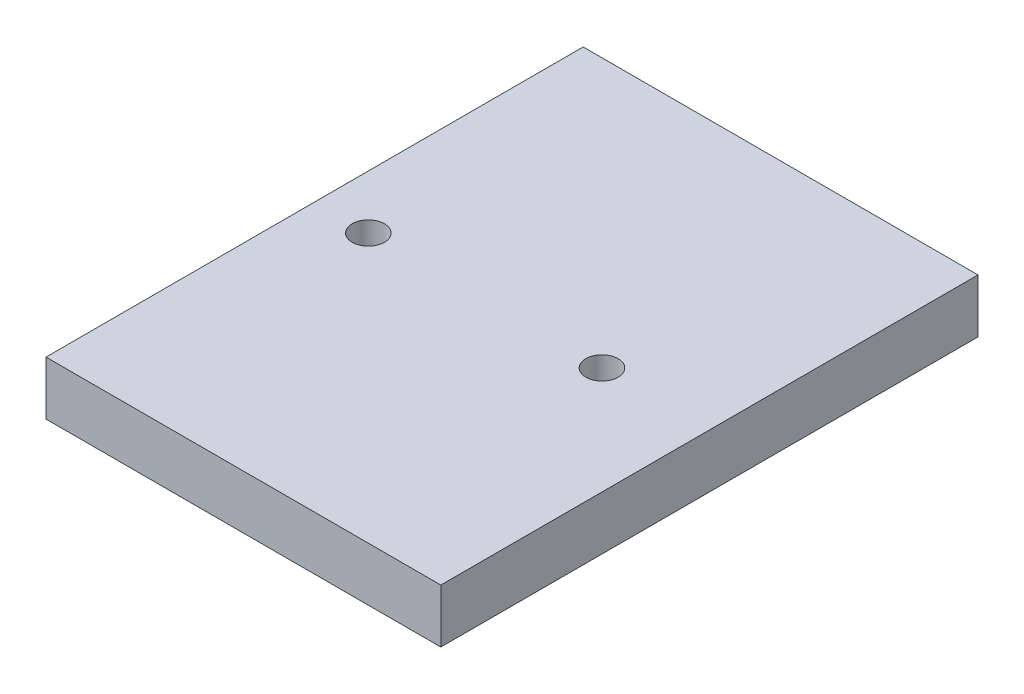
ISO-10303-21;
HEADER;
FILE_DESCRIPTION(('STEP AP214'),'2;1');
FILE_NAME('part.step','',(''),(''),'','','');
FILE_SCHEMA(('AUTOMOTIVE_DESIGN { 1 0 10303 214 1 1 1 1 }'));
ENDSEC;
DATA;
#1=APPLICATION_CONTEXT('core data for automotive mechanical design processes');
#2=APPLICATION_PROTOCOL_DEFINITION('international standard','automotive_design',2000,#1);
#3=PRODUCT_CONTEXT('',#1,'mechanical');
#4=PRODUCT('Part','Part','',(#3));
#5=PRODUCT_RELATED_PRODUCT_CATEGORY('part','',(#4));
#6=PRODUCT_DEFINITION_FORMATION('','',#4);
#7=PRODUCT_DEFINITION_CONTEXT('part definition',#1,'design');
#8=PRODUCT_DEFINITION('design','',#6,#7);
#9=PRODUCT_DEFINITION_SHAPE('','',#8);
#10=(LENGTH_UNIT() NAMED_UNIT(*) SI_UNIT(.MILLI.,.METRE.));
#11=(NAMED_UNIT(*) PLANE_ANGLE_UNIT() SI_UNIT($,.RADIAN.));
#12=(NAMED_UNIT(*) SI_UNIT($,.STERADIAN.) SOLID_ANGLE_UNIT());
#13=UNCERTAINTY_MEASURE_WITH_UNIT(LENGTH_MEASURE(1.E-05),#10,'distance_accuracy_value','');
#14=(GEOMETRIC_REPRESENTATION_CONTEXT(3) GLOBAL_UNCERTAINTY_ASSIGNED_CONTEXT((#13)) GLOBAL_UNIT_ASSIGNED_CONTEXT((#10,
#11,#12)) REPRESENTATION_CONTEXT('',''));
#15=CARTESIAN_POINT('',(0.,0.,0.));
#16=DIRECTION('',(0.,0.,1.));
#17=DIRECTION('',(1.,0.,0.));
#18=AXIS2_PLACEMENT_3D('',#15,#16,#17);
#19=CARTESIAN_POINT('',(0.,5.,0.));
#20=DIRECTION('',(0.,1.,0.));
#21=DIRECTION('',(0.,0.,1.));
#22=AXIS2_PLACEMENT_3D('',#19,#20,#21);
#23=PLANE('',#22);
#24=CARTESIAN_POINT('',(-31.75,5.,5.));
#25=DIRECTION('',(0.,1.,0.));
#26=DIRECTION('',(0.,0.,1.));
#27=AXIS2_PLACEMENT_3D('',#24,#25,#26);
#28=CIRCLE('',#27,1.5);
#29=CARTESIAN_POINT('',(-31.75,5.,6.5));
#30=VERTEX_POINT('',#29);
#31=EDGE_CURVE('E146',#30,#30,#28,.T.);
#32=ORIENTED_EDGE('',*,*,#31,.F.);
#33=EDGE_LOOP('',(#32));
#34=FACE_BOUND('',#33,.T.);
#35=DIRECTION('',(0.,0.,1.));
#36=VECTOR('',#35,1.);
#37=CARTESIAN_POINT('',(0.,5.,0.));
#38=LINE('',#37,#36);
#39=CARTESIAN_POINT('',(0.,5.,-20.));
#40=VERTEX_POINT('',#39);
#41=CARTESIAN_POINT('',(0.,5.,30.));
#42=VERTEX_POINT('',#41);
#43=EDGE_CURVE('E12',#40,#42,#38,.T.);
#44=ORIENTED_EDGE('',*,*,#43,.F.);
#45=DIRECTION('',(-1.,0.,0.));
#46=VECTOR('',#45,1.);
#47=CARTESIAN_POINT('',(0.,5.,-20.));
#48=LINE('',#47,#46);
#49=CARTESIAN_POINT('',(-36.75,5.,-20.));
#50=VERTEX_POINT('',#49);
#51=EDGE_CURVE('E118',#40,#50,#48,.T.);
#52=ORIENTED_EDGE('',*,*,#51,.T.);
#53=DIRECTION('',(0.,0.,1.));
#54=VECTOR('',#53,1.);
#55=CARTESIAN_POINT('',(-36.75,5.,0.));
#56=LINE('',#55,#54);
#57=CARTESIAN_POINT('',(-36.75,5.,30.));
#58=VERTEX_POINT('',#57);
#59=EDGE_CURVE('E74',#50,#58,#56,.T.);
#60=ORIENTED_EDGE('',*,*,#59,.T.);
#61=DIRECTION('',(-1.,0.,0.));
#62=VECTOR('',#61,1.);
#63=CARTESIAN_POINT('',(-36.75,5.,30.));
#64=LINE('',#63,#62);
#65=EDGE_CURVE('E141',#42,#58,#64,.T.);
#66=ORIENTED_EDGE('',*,*,#65,.F.);
#67=EDGE_LOOP('',(#44,#52,#60,#66));
#68=FACE_BOUND('',#67,.T.);
#69=CARTESIAN_POINT('',(-9.99999999999998,5.,5.));
#70=DIRECTION('',(0.,1.,0.));
#71=DIRECTION('',(0.,0.,1.));
#72=AXIS2_PLACEMENT_3D('',#69,#70,#71);
#73=CIRCLE('',#72,1.5);
#74=CARTESIAN_POINT('',(-9.99999999999998,5.,6.5));
#75=VERTEX_POINT('',#74);
#76=EDGE_CURVE('E143',#75,#75,#73,.T.);
#77=ORIENTED_EDGE('',*,*,#76,.F.);
#78=EDGE_LOOP('',(#77));
#79=FACE_BOUND('',#78,.T.);
#80=ADVANCED_FACE('F65',(#34,#68,#79),#23,.T.);
#81=CARTESIAN_POINT('',(0.,0.,0.));
#82=DIRECTION('',(0.,1.,0.));
#83=DIRECTION('',(0.,0.,1.));
#84=AXIS2_PLACEMENT_3D('',#81,#82,#83);
#85=PLANE('',#84);
#86=CARTESIAN_POINT('',(-31.75,0.,5.));
#87=DIRECTION('',(0.,1.,0.));
#88=DIRECTION('',(0.,0.,1.));
#89=AXIS2_PLACEMENT_3D('',#86,#87,#88);
#90=CIRCLE('',#89,2.25);
#91=CARTESIAN_POINT('',(-31.75,0.,7.25));
#92=VERTEX_POINT('',#91);
#93=EDGE_CURVE('E158',#92,#92,#90,.T.);
#94=ORIENTED_EDGE('',*,*,#93,.T.);
#95=EDGE_LOOP('',(#94));
#96=FACE_BOUND('',#95,.T.);
#97=CARTESIAN_POINT('',(-9.99999999999998,0.,5.));
#98=DIRECTION('',(0.,1.,0.));
#99=DIRECTION('',(0.,0.,1.));
#100=AXIS2_PLACEMENT_3D('',#97,#98,#99);
#101=CIRCLE('',#100,2.25);
#102=CARTESIAN_POINT('',(-9.99999999999998,0.,7.25));
#103=VERTEX_POINT('',#102);
#104=EDGE_CURVE('E163',#103,#103,#101,.T.);
#105=ORIENTED_EDGE('',*,*,#104,.T.);
#106=EDGE_LOOP('',(#105));
#107=FACE_BOUND('',#106,.T.);
#108=DIRECTION('',(0.,0.,1.));
#109=VECTOR('',#108,1.);
#110=CARTESIAN_POINT('',(-36.75,0.,0.));
#111=LINE('',#110,#109);
#112=CARTESIAN_POINT('',(-36.75,0.,-20.));
#113=VERTEX_POINT('',#112);
#114=CARTESIAN_POINT('',(-36.75,0.,30.));
#115=VERTEX_POINT('',#114);
#116=EDGE_CURVE('E148',#113,#115,#111,.T.);
#117=ORIENTED_EDGE('',*,*,#116,.F.);
#118=DIRECTION('',(1.,0.,0.));
#119=VECTOR('',#118,1.);
#120=CARTESIAN_POINT('',(0.,0.,-20.));
#121=LINE('',#120,#119);
#122=CARTESIAN_POINT('',(0.,0.,-20.));
#123=VERTEX_POINT('',#122);
#124=EDGE_CURVE('E120',#113,#123,#121,.T.);
#125=ORIENTED_EDGE('',*,*,#124,.T.);
#126=DIRECTION('',(0.,0.,1.));
#127=VECTOR('',#126,1.);
#128=CARTESIAN_POINT('',(0.,0.,0.));
#129=LINE('',#128,#127);
#130=CARTESIAN_POINT('',(0.,0.,30.));
#131=VERTEX_POINT('',#130);
#132=EDGE_CURVE('E111',#123,#131,#129,.T.);
#133=ORIENTED_EDGE('',*,*,#132,.T.);
#134=DIRECTION('',(1.,0.,0.));
#135=VECTOR('',#134,1.);
#136=CARTESIAN_POINT('',(-36.75,0.,30.));
#137=LINE('',#136,#135);
#138=EDGE_CURVE('E136',#115,#131,#137,.T.);
#139=ORIENTED_EDGE('',*,*,#138,.F.);
#140=EDGE_LOOP('',(#117,#125,#133,#139));
#141=FACE_BOUND('',#140,.T.);
#142=ADVANCED_FACE('F183',(#96,#107,#141),#85,.F.);
#143=CARTESIAN_POINT('',(-36.75,5.,0.));
#144=DIRECTION('',(1.,0.,0.));
#145=DIRECTION('',(0.,0.,-1.));
#146=AXIS2_PLACEMENT_3D('',#143,#144,#145);
#147=PLANE('',#146);
#148=CARTESIAN_POINT('',(-36.75,2.5,-10.));
#149=DIRECTION('',(-1.,0.,0.));
#150=DIRECTION('',(0.,0.,1.));
#151=AXIS2_PLACEMENT_3D('',#148,#149,#150);
#152=CIRCLE('',#151,1.);
#153=CARTESIAN_POINT('',(-36.75,2.5,-9.));
#154=VERTEX_POINT('',#153);
#155=EDGE_CURVE('E126',#154,#154,#152,.T.);
#156=ORIENTED_EDGE('',*,*,#155,.F.);
#157=EDGE_LOOP('',(#156));
#158=FACE_BOUND('',#157,.T.);
#159=CARTESIAN_POINT('',(-36.75,2.5,20.));
#160=DIRECTION('',(-1.,0.,0.));
#161=DIRECTION('',(0.,0.,1.));
#162=AXIS2_PLACEMENT_3D('',#159,#160,#161);
#163=CIRCLE('',#162,1.);
#164=CARTESIAN_POINT('',(-36.75,2.5,21.));
#165=VERTEX_POINT('',#164);
#166=EDGE_CURVE('E129',#165,#165,#163,.T.);
#167=ORIENTED_EDGE('',*,*,#166,.F.);
#168=EDGE_LOOP('',(#167));
#169=FACE_BOUND('',#168,.T.);
#170=ORIENTED_EDGE('',*,*,#116,.T.);
#171=DIRECTION('',(0.,-1.,0.));
#172=VECTOR('',#171,1.);
#173=CARTESIAN_POINT('',(-36.75,5.,30.));
#174=LINE('',#173,#172);
#175=EDGE_CURVE('E110',#58,#115,#174,.T.);
#176=ORIENTED_EDGE('',*,*,#175,.F.);
#177=ORIENTED_EDGE('',*,*,#59,.F.);
#178=DIRECTION('',(0.,-1.,0.));
#179=VECTOR('',#178,1.);
#180=CARTESIAN_POINT('',(-36.75,5.,-20.));
#181=LINE('',#180,#179);
#182=EDGE_CURVE('E108',#50,#113,#181,.T.);
#183=ORIENTED_EDGE('',*,*,#182,.T.);
#184=EDGE_LOOP('',(#170,#176,#177,#183));
#185=FACE_BOUND('',#184,.T.);
#186=ADVANCED_FACE('F67',(#158,#169,#185),#147,.F.);
#187=CARTESIAN_POINT('',(0.,5.,0.));
#188=DIRECTION('',(1.,0.,0.));
#189=DIRECTION('',(0.,0.,-1.));
#190=AXIS2_PLACEMENT_3D('',#187,#188,#189);
#191=PLANE('',#190);
#192=ORIENTED_EDGE('',*,*,#132,.F.);
#193=DIRECTION('',(0.,1.,0.));
#194=VECTOR('',#193,1.);
#195=CARTESIAN_POINT('',(0.,5.,-20.));
#196=LINE('',#195,#194);
#197=EDGE_CURVE('E133',#123,#40,#196,.T.);
#198=ORIENTED_EDGE('',*,*,#197,.T.);
#199=ORIENTED_EDGE('',*,*,#43,.T.);
#200=DIRECTION('',(0.,1.,0.));
#201=VECTOR('',#200,1.);
#202=CARTESIAN_POINT('',(0.,5.,30.));
#203=LINE('',#202,#201);
#204=EDGE_CURVE('E139',#131,#42,#203,.T.);
#205=ORIENTED_EDGE('',*,*,#204,.F.);
#206=EDGE_LOOP('',(#192,#198,#199,#205));
#207=FACE_BOUND('',#206,.T.);
#208=ADVANCED_FACE('F182',(#207),#191,.T.);
#209=CARTESIAN_POINT('',(-31.75,5.,5.));
#210=DIRECTION('',(0.,-1.,0.));
#211=DIRECTION('',(0.,0.,-1.));
#212=AXIS2_PLACEMENT_3D('',#209,#210,#211);
#213=CYLINDRICAL_SURFACE('',#212,1.5);
#214=CARTESIAN_POINT('',(-31.75,2.,5.));
#215=DIRECTION('',(0.,1.,0.));
#216=DIRECTION('',(0.,0.,1.));
#217=AXIS2_PLACEMENT_3D('',#214,#215,#216);
#218=CIRCLE('',#217,1.5);
#219=CARTESIAN_POINT('',(-31.75,2.,6.5));
#220=VERTEX_POINT('',#219);
#221=EDGE_CURVE('E69',#220,#220,#218,.T.);
#222=ORIENTED_EDGE('',*,*,#221,.F.);
#223=EDGE_LOOP('',(#222));
#224=FACE_BOUND('',#223,.T.);
#225=ORIENTED_EDGE('',*,*,#31,.T.);
#226=EDGE_LOOP('',(#225));
#227=FACE_BOUND('',#226,.T.);
#228=ADVANCED_FACE('F190',(#224,#227),#213,.F.);
#229=CARTESIAN_POINT('',(-9.99999999999998,5.,5.));
#230=DIRECTION('',(0.,-1.,0.));
#231=DIRECTION('',(0.,0.,-1.));
#232=AXIS2_PLACEMENT_3D('',#229,#230,#231);
#233=CYLINDRICAL_SURFACE('',#232,1.5);
#234=CARTESIAN_POINT('',(-9.99999999999998,2.,5.));
#235=DIRECTION('',(0.,1.,0.));
#236=DIRECTION('',(0.,0.,1.));
#237=AXIS2_PLACEMENT_3D('',#234,#235,#236);
#238=CIRCLE('',#237,1.5);
#239=CARTESIAN_POINT('',(-9.99999999999998,2.,6.5));
#240=VERTEX_POINT('',#239);
#241=EDGE_CURVE('E151',#240,#240,#238,.T.);
#242=ORIENTED_EDGE('',*,*,#241,.F.);
#243=EDGE_LOOP('',(#242));
#244=FACE_BOUND('',#243,.T.);
#245=ORIENTED_EDGE('',*,*,#76,.T.);
#246=EDGE_LOOP('',(#245));
#247=FACE_BOUND('',#246,.T.);
#248=ADVANCED_FACE('F205',(#244,#247),#233,.F.);
#249=CARTESIAN_POINT('',(0.,0.,30.));
#250=DIRECTION('',(0.,0.,1.));
#251=DIRECTION('',(1.,0.,0.));
#252=AXIS2_PLACEMENT_3D('',#249,#250,#251);
#253=PLANE('',#252);
#254=ORIENTED_EDGE('',*,*,#175,.T.);
#255=ORIENTED_EDGE('',*,*,#138,.T.);
#256=ORIENTED_EDGE('',*,*,#204,.T.);
#257=ORIENTED_EDGE('',*,*,#65,.T.);
#258=EDGE_LOOP('',(#254,#255,#256,#257));
#259=FACE_BOUND('',#258,.T.);
#260=ADVANCED_FACE('F209',(#259),#253,.T.);
#261=CARTESIAN_POINT('',(0.,0.,-20.));
#262=DIRECTION('',(0.,0.,1.));
#263=DIRECTION('',(1.,0.,0.));
#264=AXIS2_PLACEMENT_3D('',#261,#262,#263);
#265=PLANE('',#264);
#266=ORIENTED_EDGE('',*,*,#51,.F.);
#267=ORIENTED_EDGE('',*,*,#197,.F.);
#268=ORIENTED_EDGE('',*,*,#124,.F.);
#269=ORIENTED_EDGE('',*,*,#182,.F.);
#270=EDGE_LOOP('',(#266,#267,#268,#269));
#271=FACE_BOUND('',#270,.T.);
#272=ADVANCED_FACE('F116',(#271),#265,.F.);
#273=CARTESIAN_POINT('',(-32.75,2.5,20.));
#274=DIRECTION('',(-1.,0.,0.));
#275=DIRECTION('',(0.,0.,1.));
#276=AXIS2_PLACEMENT_3D('',#273,#274,#275);
#277=CYLINDRICAL_SURFACE('',#276,1.);
#278=CARTESIAN_POINT('',(-32.75,2.5,20.));
#279=DIRECTION('',(-1.,0.,0.));
#280=DIRECTION('',(0.,0.,1.));
#281=AXIS2_PLACEMENT_3D('',#278,#279,#280);
#282=CIRCLE('',#281,1.);
#283=CARTESIAN_POINT('',(-32.75,2.5,21.));
#284=VERTEX_POINT('',#283);
#285=EDGE_CURVE('E172',#284,#284,#282,.T.);
#286=ORIENTED_EDGE('',*,*,#285,.F.);
#287=EDGE_LOOP('',(#286));
#288=FACE_BOUND('',#287,.T.);
#289=ORIENTED_EDGE('',*,*,#166,.T.);
#290=EDGE_LOOP('',(#289));
#291=FACE_BOUND('',#290,.T.);
#292=ADVANCED_FACE('F179',(#288,#291),#277,.F.);
#293=CARTESIAN_POINT('',(-32.75,2.5,20.));
#294=DIRECTION('',(-1.,0.,0.));
#295=DIRECTION('',(0.,0.,1.));
#296=AXIS2_PLACEMENT_3D('',#293,#294,#295);
#297=PLANE('',#296);
#298=ORIENTED_EDGE('',*,*,#285,.T.);
#299=EDGE_LOOP('',(#298));
#300=FACE_BOUND('',#299,.T.);
#301=ADVANCED_FACE('F218',(#300),#297,.T.);
#302=CARTESIAN_POINT('',(-32.75,2.5,-10.));
#303=DIRECTION('',(-1.,0.,0.));
#304=DIRECTION('',(0.,0.,1.));
#305=AXIS2_PLACEMENT_3D('',#302,#303,#304);
#306=CYLINDRICAL_SURFACE('',#305,1.);
#307=CARTESIAN_POINT('',(-32.75,2.5,-10.));
#308=DIRECTION('',(-1.,0.,0.));
#309=DIRECTION('',(0.,0.,1.));
#310=AXIS2_PLACEMENT_3D('',#307,#308,#309);
#311=CIRCLE('',#310,1.);
#312=CARTESIAN_POINT('',(-32.75,2.5,-9.));
#313=VERTEX_POINT('',#312);
#314=EDGE_CURVE('E123',#313,#313,#311,.T.);
#315=ORIENTED_EDGE('',*,*,#314,.F.);
#316=EDGE_LOOP('',(#315));
#317=FACE_BOUND('',#316,.T.);
#318=ORIENTED_EDGE('',*,*,#155,.T.);
#319=EDGE_LOOP('',(#318));
#320=FACE_BOUND('',#319,.T.);
#321=ADVANCED_FACE('F222',(#317,#320),#306,.F.);
#322=CARTESIAN_POINT('',(-32.75,2.5,-10.));
#323=DIRECTION('',(-1.,0.,0.));
#324=DIRECTION('',(0.,0.,1.));
#325=AXIS2_PLACEMENT_3D('',#322,#323,#324);
#326=PLANE('',#325);
#327=ORIENTED_EDGE('',*,*,#314,.T.);
#328=EDGE_LOOP('',(#327));
#329=FACE_BOUND('',#328,.T.);
#330=ADVANCED_FACE('F225',(#329),#326,.T.);
#331=CARTESIAN_POINT('',(-9.99999999999998,2.,5.));
#332=DIRECTION('',(0.,-1.,0.));
#333=DIRECTION('',(0.,0.,-1.));
#334=AXIS2_PLACEMENT_3D('',#331,#332,#333);
#335=CYLINDRICAL_SURFACE('',#334,2.25);
#336=CARTESIAN_POINT('',(-9.99999999999998,2.,5.));
#337=DIRECTION('',(0.,1.,0.));
#338=DIRECTION('',(0.,0.,1.));
#339=AXIS2_PLACEMENT_3D('',#336,#337,#338);
#340=CIRCLE('',#339,2.25);
#341=CARTESIAN_POINT('',(-9.99999999999998,2.,7.25));
#342=VERTEX_POINT('',#341);
#343=EDGE_CURVE('E168',#342,#342,#340,.T.);
#344=ORIENTED_EDGE('',*,*,#343,.T.);
#345=EDGE_LOOP('',(#344));
#346=FACE_BOUND('',#345,.T.);
#347=ORIENTED_EDGE('',*,*,#104,.F.);
#348=EDGE_LOOP('',(#347));
#349=FACE_BOUND('',#348,.T.);
#350=ADVANCED_FACE('F229',(#346,#349),#335,.F.);
#351=CARTESIAN_POINT('',(-9.99999999999998,2.,5.));
#352=DIRECTION('',(0.,1.,0.));
#353=DIRECTION('',(0.,0.,1.));
#354=AXIS2_PLACEMENT_3D('',#351,#352,#353);
#355=PLANE('',#354);
#356=ORIENTED_EDGE('',*,*,#241,.T.);
#357=EDGE_LOOP('',(#356));
#358=FACE_BOUND('',#357,.T.);
#359=ORIENTED_EDGE('',*,*,#343,.F.);
#360=EDGE_LOOP('',(#359));
#361=FACE_BOUND('',#360,.T.);
#362=ADVANCED_FACE('F231',(#358,#361),#355,.F.);
#363=CARTESIAN_POINT('',(-31.75,2.,5.));
#364=DIRECTION('',(0.,-1.,0.));
#365=DIRECTION('',(0.,0.,-1.));
#366=AXIS2_PLACEMENT_3D('',#363,#364,#365);
#367=CYLINDRICAL_SURFACE('',#366,2.25);
#368=CARTESIAN_POINT('',(-31.75,2.,5.));
#369=DIRECTION('',(0.,1.,0.));
#370=DIRECTION('',(0.,0.,1.));
#371=AXIS2_PLACEMENT_3D('',#368,#369,#370);
#372=CIRCLE('',#371,2.25);
#373=CARTESIAN_POINT('',(-31.75,2.,7.25));
#374=VERTEX_POINT('',#373);
#375=EDGE_CURVE('E153',#374,#374,#372,.T.);
#376=ORIENTED_EDGE('',*,*,#375,.T.);
#377=EDGE_LOOP('',(#376));
#378=FACE_BOUND('',#377,.T.);
#379=ORIENTED_EDGE('',*,*,#93,.F.);
#380=EDGE_LOOP('',(#379));
#381=FACE_BOUND('',#380,.T.);
#382=ADVANCED_FACE('F234',(#378,#381),#367,.F.);
#383=CARTESIAN_POINT('',(-31.75,2.,5.));
#384=DIRECTION('',(0.,1.,0.));
#385=DIRECTION('',(0.,0.,1.));
#386=AXIS2_PLACEMENT_3D('',#383,#384,#385);
#387=PLANE('',#386);
#388=ORIENTED_EDGE('',*,*,#221,.T.);
#389=EDGE_LOOP('',(#388));
#390=FACE_BOUND('',#389,.T.);
#391=ORIENTED_EDGE('',*,*,#375,.F.);
#392=EDGE_LOOP('',(#391));
#393=FACE_BOUND('',#392,.T.);
#394=ADVANCED_FACE('F240',(#390,#393),#387,.F.);
#395=CLOSED_SHELL('',(#80,#142,#186,#208,#228,#248,#260,#272,#292,#301,#321,#330,#350,#362,#382,#394));
#396=MANIFOLD_SOLID_BREP('B2',#395);
#397=ADVANCED_BREP_SHAPE_REPRESENTATION('',(#18,#396),#14);
#398=SHAPE_DEFINITION_REPRESENTATION(#9,#397);
ENDSEC;
END-ISO-10303-21;
